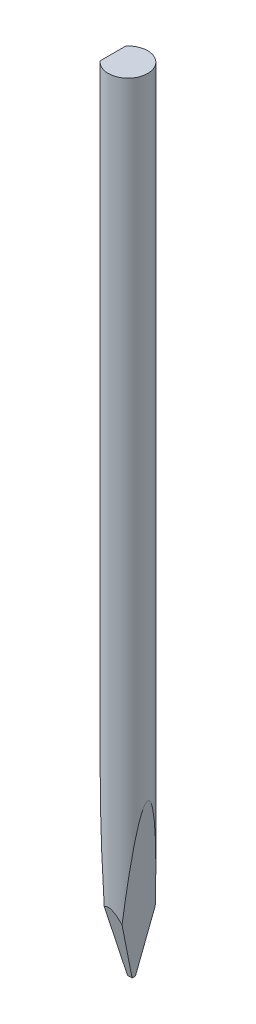
ISO-10303-21;
HEADER;
FILE_DESCRIPTION(('STEP AP214'),'2;1');
FILE_NAME('part.step','',(''),(''),'','','');
FILE_SCHEMA(('AUTOMOTIVE_DESIGN { 1 0 10303 214 1 1 1 1 }'));
ENDSEC;
DATA;
#1=APPLICATION_CONTEXT('core data for automotive mechanical design processes');
#2=APPLICATION_PROTOCOL_DEFINITION('international standard','automotive_design',2000,#1);
#3=PRODUCT_CONTEXT('',#1,'mechanical');
#4=PRODUCT('Part','Part','',(#3));
#5=PRODUCT_RELATED_PRODUCT_CATEGORY('part','',(#4));
#6=PRODUCT_DEFINITION_FORMATION('','',#4);
#7=PRODUCT_DEFINITION_CONTEXT('part definition',#1,'design');
#8=PRODUCT_DEFINITION('design','',#6,#7);
#9=PRODUCT_DEFINITION_SHAPE('','',#8);
#10=(LENGTH_UNIT() NAMED_UNIT(*) SI_UNIT(.MILLI.,.METRE.));
#11=(NAMED_UNIT(*) PLANE_ANGLE_UNIT() SI_UNIT($,.RADIAN.));
#12=(NAMED_UNIT(*) SI_UNIT($,.STERADIAN.) SOLID_ANGLE_UNIT());
#13=UNCERTAINTY_MEASURE_WITH_UNIT(LENGTH_MEASURE(1.E-05),#10,'distance_accuracy_value','');
#14=(GEOMETRIC_REPRESENTATION_CONTEXT(3) GLOBAL_UNCERTAINTY_ASSIGNED_CONTEXT((#13)) GLOBAL_UNIT_ASSIGNED_CONTEXT((#10,
#11,#12)) REPRESENTATION_CONTEXT('',''));
#15=CARTESIAN_POINT('',(0.,0.,0.));
#16=DIRECTION('',(0.,0.,1.));
#17=DIRECTION('',(1.,0.,0.));
#18=AXIS2_PLACEMENT_3D('',#15,#16,#17);
#19=CARTESIAN_POINT('',(0.,0.,0.));
#20=DIRECTION('',(0.,1.,0.));
#21=DIRECTION('',(0.,0.,1.));
#22=AXIS2_PLACEMENT_3D('',#19,#20,#21);
#23=PLANE('',#22);
#24=DIRECTION('',(0.,0.,-1.));
#25=VECTOR('',#24,1.);
#26=CARTESIAN_POINT('',(0.46355,0.,80.8360855398669));
#27=LINE('',#26,#25);
#28=CARTESIAN_POINT('',(0.463549999999997,0.,0.13335000000001));
#29=VERTEX_POINT('',#28);
#30=CARTESIAN_POINT('',(0.46355,0.,-0.13335));
#31=VERTEX_POINT('',#30);
#32=EDGE_CURVE('E54',#29,#31,#27,.T.);
#33=ORIENTED_EDGE('',*,*,#32,.F.);
#34=DIRECTION('',(-1.,0.,0.));
#35=VECTOR('',#34,1.);
#36=CARTESIAN_POINT('',(81.0604131023871,0.,0.13335));
#37=LINE('',#36,#35);
#38=CARTESIAN_POINT('',(0.0952500000000043,0.,0.133350000000003));
#39=VERTEX_POINT('',#38);
#40=EDGE_CURVE('E104',#29,#39,#37,.T.);
#41=ORIENTED_EDGE('',*,*,#40,.T.);
#42=DIRECTION('',(0.,0.,-1.));
#43=VECTOR('',#42,1.);
#44=CARTESIAN_POINT('',(0.0952500000000003,0.,80.8360855398669));
#45=LINE('',#44,#43);
#46=CARTESIAN_POINT('',(0.0952500000000045,0.,-0.133349999999995));
#47=VERTEX_POINT('',#46);
#48=EDGE_CURVE('E89',#39,#47,#45,.T.);
#49=ORIENTED_EDGE('',*,*,#48,.T.);
#50=DIRECTION('',(-1.,0.,0.));
#51=VECTOR('',#50,1.);
#52=CARTESIAN_POINT('',(81.0604131023871,0.,-0.13335));
#53=LINE('',#52,#51);
#54=EDGE_CURVE('E110',#31,#47,#53,.T.);
#55=ORIENTED_EDGE('',*,*,#54,.F.);
#56=EDGE_LOOP('',(#33,#41,#49,#55));
#57=FACE_BOUND('',#56,.T.);
#58=ADVANCED_FACE('F39',(#57),#23,.F.);
#59=CARTESIAN_POINT('',(0.,63.5,0.));
#60=DIRECTION('',(0.,-1.,0.));
#61=DIRECTION('',(0.,0.,-1.));
#62=AXIS2_PLACEMENT_3D('',#59,#60,#61);
#63=CYLINDRICAL_SURFACE('',#62,1.58623);
#64=CARTESIAN_POINT('',(0.,-5.29840074494502,0.));
#65=DIRECTION('',(0.996194698091745,-0.0871557427476584,0.));
#66=DIRECTION('',(-0.0871557427476584,-0.996194698091746,0.));
#67=AXIS2_PLACEMENT_3D('',#64,#65,#66);
#68=ELLIPSE('',#67,18.1999481616789,1.58623);
#69=CARTESIAN_POINT('',(0.856037795649053,4.48615603246424,-1.33541188601881));
#70=VERTEX_POINT('',#69);
#71=CARTESIAN_POINT('',(0.856037795649059,4.48615603246423,1.3354118860188));
#72=VERTEX_POINT('',#71);
#73=EDGE_CURVE('E107',#70,#72,#68,.T.);
#74=ORIENTED_EDGE('',*,*,#73,.F.);
#75=CARTESIAN_POINT('',(0.,-0.497668975189311,0.));
#76=DIRECTION('',(0.,-0.258819045102522,-0.965925826289068));
#77=DIRECTION('',(0.,-0.965925826289068,0.258819045102522));
#78=AXIS2_PLACEMENT_3D('',#75,#76,#77);
#79=ELLIPSE('',#78,6.12872209373802,1.58623);
#80=CARTESIAN_POINT('',(-0.365218019910235,5.26317355132303,-1.54361310270185));
#81=VERTEX_POINT('',#80);
#82=EDGE_CURVE('E118',#81,#70,#79,.T.);
#83=ORIENTED_EDGE('',*,*,#82,.F.);
#84=CARTESIAN_POINT('',(0.,1.08871248183801,0.));
#85=DIRECTION('',(-0.996194698091745,-0.0871557427476583,0.));
#86=DIRECTION('',(0.0871557427476583,-0.996194698091746,0.));
#87=AXIS2_PLACEMENT_3D('',#84,#85,#86);
#88=ELLIPSE('',#87,18.1999481616789,1.58623);
#89=CARTESIAN_POINT('',(-1.20777,14.8935867515441,-1.02830794998386));
#90=VERTEX_POINT('',#89);
#91=EDGE_CURVE('E61',#90,#81,#88,.T.);
#92=ORIENTED_EDGE('',*,*,#91,.F.);
#93=DIRECTION('',(0.,-1.,0.));
#94=VECTOR('',#93,1.);
#95=CARTESIAN_POINT('',(-1.20777,63.5,-1.02830794998386));
#96=LINE('',#95,#94);
#97=CARTESIAN_POINT('',(-1.20777,63.5,-1.02830794998385));
#98=VERTEX_POINT('',#97);
#99=EDGE_CURVE('E125',#98,#90,#96,.T.);
#100=ORIENTED_EDGE('',*,*,#99,.F.);
#101=CARTESIAN_POINT('',(0.,63.5,0.));
#102=DIRECTION('',(0.,1.,0.));
#103=DIRECTION('',(0.,0.,1.));
#104=AXIS2_PLACEMENT_3D('',#101,#102,#103);
#105=CIRCLE('',#104,1.58623);
#106=CARTESIAN_POINT('',(-1.20777,63.5,1.02830794998386));
#107=VERTEX_POINT('',#106);
#108=EDGE_CURVE('E128',#107,#98,#105,.T.);
#109=ORIENTED_EDGE('',*,*,#108,.F.);
#110=DIRECTION('',(0.,-1.,0.));
#111=VECTOR('',#110,1.);
#112=CARTESIAN_POINT('',(-1.20777,63.5,1.02830794998386));
#113=LINE('',#112,#111);
#114=CARTESIAN_POINT('',(-1.20777,14.8935867515441,1.02830794998386));
#115=VERTEX_POINT('',#114);
#116=EDGE_CURVE('E123',#115,#107,#113,.F.);
#117=ORIENTED_EDGE('',*,*,#116,.F.);
#118=CARTESIAN_POINT('',(-0.365218019910243,5.26317355132302,1.54361310270185));
#119=VERTEX_POINT('',#118);
#120=EDGE_CURVE('E108',#119,#115,#88,.T.);
#121=ORIENTED_EDGE('',*,*,#120,.F.);
#122=CARTESIAN_POINT('',(0.,-0.497668975189311,0.));
#123=DIRECTION('',(0.,-0.258819045102522,0.965925826289068));
#124=DIRECTION('',(0.,-0.965925826289068,-0.258819045102522));
#125=AXIS2_PLACEMENT_3D('',#122,#123,#124);
#126=ELLIPSE('',#125,6.12872209373802,1.58623);
#127=EDGE_CURVE('E106',#72,#119,#126,.T.);
#128=ORIENTED_EDGE('',*,*,#127,.F.);
#129=EDGE_LOOP('',(#74,#83,#92,#100,#109,#117,#121,#128));
#130=FACE_BOUND('',#129,.T.);
#131=ADVANCED_FACE('F41',(#130),#63,.T.);
#132=CARTESIAN_POINT('',(-1.20777,63.5,1.59623));
#133=DIRECTION('',(-1.,0.,0.));
#134=DIRECTION('',(0.,0.,1.));
#135=AXIS2_PLACEMENT_3D('',#132,#133,#134);
#136=PLANE('',#135);
#137=ORIENTED_EDGE('',*,*,#99,.T.);
#138=DIRECTION('',(0.,0.,1.));
#139=VECTOR('',#138,1.);
#140=CARTESIAN_POINT('',(-1.20777,14.8935867515441,1.59623));
#141=LINE('',#140,#139);
#142=EDGE_CURVE('E137',#90,#115,#141,.T.);
#143=ORIENTED_EDGE('',*,*,#142,.T.);
#144=ORIENTED_EDGE('',*,*,#116,.T.);
#145=DIRECTION('',(0.,0.,-1.));
#146=VECTOR('',#145,1.);
#147=CARTESIAN_POINT('',(-1.20777,63.5,1.59623));
#148=LINE('',#147,#146);
#149=EDGE_CURVE('E121',#107,#98,#148,.T.);
#150=ORIENTED_EDGE('',*,*,#149,.T.);
#151=EDGE_LOOP('',(#137,#143,#144,#150));
#152=FACE_BOUND('',#151,.T.);
#153=ADVANCED_FACE('F143',(#152),#136,.T.);
#154=CARTESIAN_POINT('',(81.0604131023871,0.,0.13335));
#155=DIRECTION('',(0.,-0.258819045102522,0.965925826289068));
#156=DIRECTION('',(0.,-0.965925826289068,-0.258819045102522));
#157=AXIS2_PLACEMENT_3D('',#154,#155,#156);
#158=PLANE('',#157);
#159=ORIENTED_EDGE('',*,*,#40,.F.);
#160=DIRECTION('',(0.0842074097641779,0.962495097884607,0.257899784197096));
#161=VECTOR('',#160,1.);
#162=CARTESIAN_POINT('',(1.03505331806168,6.53231281664674,1.88367794392797));
#163=LINE('',#162,#161);
#164=EDGE_CURVE('E111',#29,#72,#163,.T.);
#165=ORIENTED_EDGE('',*,*,#164,.T.);
#166=ORIENTED_EDGE('',*,*,#127,.T.);
#167=DIRECTION('',(0.0842074097641778,-0.962495097884607,-0.257899784197096));
#168=VECTOR('',#167,1.);
#169=CARTESIAN_POINT('',(0.669364892060237,-6.56216324404258,-1.62497634184241));
#170=LINE('',#169,#168);
#171=EDGE_CURVE('E92',#119,#39,#170,.T.);
#172=ORIENTED_EDGE('',*,*,#171,.T.);
#173=EDGE_LOOP('',(#159,#165,#166,#172));
#174=FACE_BOUND('',#173,.T.);
#175=ADVANCED_FACE('F102',(#174),#158,.T.);
#176=CARTESIAN_POINT('',(81.0604131023871,0.,-0.13335));
#177=DIRECTION('',(0.,-0.258819045102522,-0.965925826289068));
#178=DIRECTION('',(0.,0.965925826289068,-0.258819045102522));
#179=AXIS2_PLACEMENT_3D('',#176,#177,#178);
#180=PLANE('',#179);
#181=ORIENTED_EDGE('',*,*,#82,.T.);
#182=DIRECTION('',(-0.0842074097641779,-0.962495097884607,0.257899784197096));
#183=VECTOR('',#182,1.);
#184=CARTESIAN_POINT('',(1.03505331806168,6.53231281664674,-1.88367794392797));
#185=LINE('',#184,#183);
#186=EDGE_CURVE('E11',#70,#31,#185,.T.);
#187=ORIENTED_EDGE('',*,*,#186,.T.);
#188=ORIENTED_EDGE('',*,*,#54,.T.);
#189=DIRECTION('',(-0.0842074097641778,0.962495097884607,-0.257899784197096));
#190=VECTOR('',#189,1.);
#191=CARTESIAN_POINT('',(0.669364892060237,-6.56216324404258,1.62497634184241));
#192=LINE('',#191,#190);
#193=EDGE_CURVE('E47',#47,#81,#192,.T.);
#194=ORIENTED_EDGE('',*,*,#193,.T.);
#195=EDGE_LOOP('',(#181,#187,#188,#194));
#196=FACE_BOUND('',#195,.T.);
#197=ADVANCED_FACE('F132',(#196),#180,.T.);
#198=CARTESIAN_POINT('',(0.,63.5,0.));
#199=DIRECTION('',(0.,1.,0.));
#200=DIRECTION('',(0.,0.,1.));
#201=AXIS2_PLACEMENT_3D('',#198,#199,#200);
#202=PLANE('',#201);
#203=ORIENTED_EDGE('',*,*,#108,.T.);
#204=ORIENTED_EDGE('',*,*,#149,.F.);
#205=EDGE_LOOP('',(#203,#204));
#206=FACE_BOUND('',#205,.T.);
#207=ADVANCED_FACE('F147',(#206),#202,.T.);
#208=CARTESIAN_POINT('',(0.0952500000000003,0.,80.8360855398669));
#209=DIRECTION('',(-0.996194698091745,-0.0871557427476583,0.));
#210=DIRECTION('',(0.0871557427476583,-0.996194698091746,0.));
#211=AXIS2_PLACEMENT_3D('',#208,#209,#210);
#212=PLANE('',#211);
#213=ORIENTED_EDGE('',*,*,#171,.F.);
#214=ORIENTED_EDGE('',*,*,#120,.T.);
#215=ORIENTED_EDGE('',*,*,#142,.F.);
#216=ORIENTED_EDGE('',*,*,#91,.T.);
#217=ORIENTED_EDGE('',*,*,#193,.F.);
#218=ORIENTED_EDGE('',*,*,#48,.F.);
#219=EDGE_LOOP('',(#213,#214,#215,#216,#217,#218));
#220=FACE_BOUND('',#219,.T.);
#221=ADVANCED_FACE('F91',(#220),#212,.T.);
#222=CARTESIAN_POINT('',(0.46355,0.,80.8360855398669));
#223=DIRECTION('',(0.996194698091745,-0.0871557427476584,0.));
#224=DIRECTION('',(0.0871557427476584,0.996194698091746,0.));
#225=AXIS2_PLACEMENT_3D('',#222,#223,#224);
#226=PLANE('',#225);
#227=ORIENTED_EDGE('',*,*,#164,.F.);
#228=ORIENTED_EDGE('',*,*,#32,.T.);
#229=ORIENTED_EDGE('',*,*,#186,.F.);
#230=ORIENTED_EDGE('',*,*,#73,.T.);
#231=EDGE_LOOP('',(#227,#228,#229,#230));
#232=FACE_BOUND('',#231,.T.);
#233=ADVANCED_FACE('F154',(#232),#226,.T.);
#234=CLOSED_SHELL('',(#58,#131,#153,#175,#197,#207,#221,#233));
#235=MANIFOLD_SOLID_BREP('B2',#234);
#236=ADVANCED_BREP_SHAPE_REPRESENTATION('',(#18,#235),#14);
#237=SHAPE_DEFINITION_REPRESENTATION(#9,#236);
ENDSEC;
END-ISO-10303-21;
